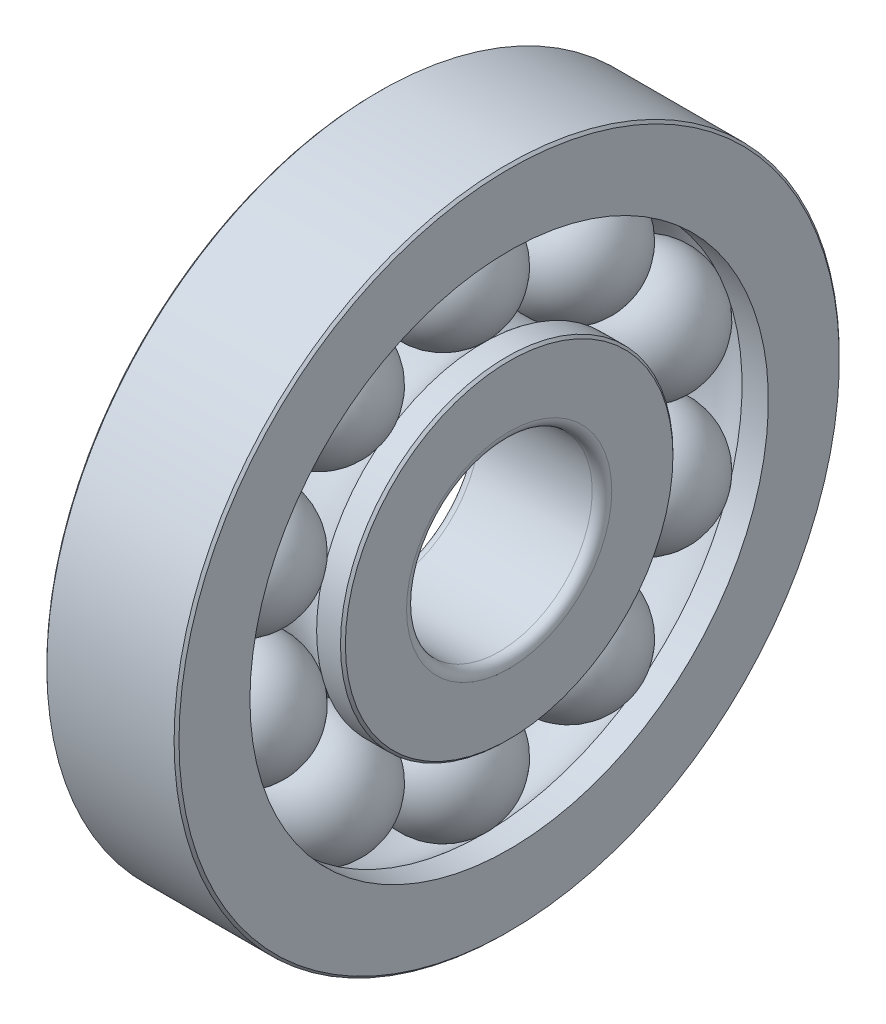
ISO-10303-21;
HEADER;
FILE_DESCRIPTION(('STEP AP214'),'2;1');
FILE_NAME('part.step','',(''),(''),'','','');
FILE_SCHEMA(('AUTOMOTIVE_DESIGN { 1 0 10303 214 1 1 1 1 }'));
ENDSEC;
DATA;
#1=APPLICATION_CONTEXT('core data for automotive mechanical design processes');
#2=APPLICATION_PROTOCOL_DEFINITION('international standard','automotive_design',2000,#1);
#3=PRODUCT_CONTEXT('',#1,'mechanical');
#4=PRODUCT('Part','Part','',(#3));
#5=PRODUCT_RELATED_PRODUCT_CATEGORY('part','',(#4));
#6=PRODUCT_DEFINITION_FORMATION('','',#4);
#7=PRODUCT_DEFINITION_CONTEXT('part definition',#1,'design');
#8=PRODUCT_DEFINITION('design','',#6,#7);
#9=PRODUCT_DEFINITION_SHAPE('','',#8);
#10=(LENGTH_UNIT() NAMED_UNIT(*) SI_UNIT(.MILLI.,.METRE.));
#11=(NAMED_UNIT(*) PLANE_ANGLE_UNIT() SI_UNIT($,.RADIAN.));
#12=(NAMED_UNIT(*) SI_UNIT($,.STERADIAN.) SOLID_ANGLE_UNIT());
#13=UNCERTAINTY_MEASURE_WITH_UNIT(LENGTH_MEASURE(1.E-05),#10,'distance_accuracy_value','');
#14=(GEOMETRIC_REPRESENTATION_CONTEXT(3) GLOBAL_UNCERTAINTY_ASSIGNED_CONTEXT((#13)) GLOBAL_UNIT_ASSIGNED_CONTEXT((#10,
#11,#12)) REPRESENTATION_CONTEXT('',''));
#15=CARTESIAN_POINT('',(0.,0.,0.));
#16=DIRECTION('',(0.,0.,1.));
#17=DIRECTION('',(1.,0.,0.));
#18=AXIS2_PLACEMENT_3D('',#15,#16,#17);
#19=CARTESIAN_POINT('',(0.,-8.3018686220501,25.550524385876));
#20=DIRECTION('',(-1.,0.,0.));
#21=DIRECTION('',(0.,0.809016994374955,0.587785252292462));
#22=AXIS2_PLACEMENT_3D('',#19,#20,#21);
#23=SPHERICAL_SURFACE('',#22,12.5);
#24=CARTESIAN_POINT('',(-12.5,-8.3018686220501,25.550524385876));
#25=VERTEX_POINT('',#24);
#26=VERTEX_LOOP('',#25);
#27=FACE_BOUND('',#26,.T.);
#28=ADVANCED_FACE('F48',(#27),#23,.T.);
#29=CLOSED_SHELL('',(#28));
#30=MANIFOLD_SOLID_BREP('B2',#29);
#31=CARTESIAN_POINT('',(0.,-30.0364428447143,41.341616886731));
#32=DIRECTION('',(-1.,0.,0.));
#33=DIRECTION('',(0.,0.309016994374958,0.95105651629515));
#34=AXIS2_PLACEMENT_3D('',#31,#32,#33);
#35=SPHERICAL_SURFACE('',#34,12.5);
#36=CARTESIAN_POINT('',(-12.5,-30.0364428447143,41.341616886731));
#37=VERTEX_POINT('',#36);
#38=VERTEX_LOOP('',#37);
#39=FACE_BOUND('',#38,.T.);
#40=ADVANCED_FACE('F70',(#39),#35,.T.);
#41=CLOSED_SHELL('',(#40));
#42=MANIFOLD_SOLID_BREP('B7',#41);
#43=CARTESIAN_POINT('',(0.,-56.9018540459421,41.3416168867312));
#44=DIRECTION('',(-1.,0.,0.));
#45=DIRECTION('',(0.,-0.309016994374938,0.951056516295157));
#46=AXIS2_PLACEMENT_3D('',#43,#44,#45);
#47=SPHERICAL_SURFACE('',#46,12.5);
#48=CARTESIAN_POINT('',(-12.5,-56.9018540459421,41.3416168867312));
#49=VERTEX_POINT('',#48);
#50=VERTEX_LOOP('',#49);
#51=FACE_BOUND('',#50,.T.);
#52=ADVANCED_FACE('F92',(#51),#47,.T.);
#53=CLOSED_SHELL('',(#52));
#54=MANIFOLD_SOLID_BREP('B44',#53);
#55=CARTESIAN_POINT('',(0.,-78.6364282686066,25.5505243858767));
#56=DIRECTION('',(-1.,0.,0.));
#57=DIRECTION('',(0.,-0.809016994374942,0.58778525229248));
#58=AXIS2_PLACEMENT_3D('',#55,#56,#57);
#59=SPHERICAL_SURFACE('',#58,12.5);
#60=CARTESIAN_POINT('',(-12.5,-78.6364282686066,25.5505243858767));
#61=VERTEX_POINT('',#60);
#62=VERTEX_LOOP('',#61);
#63=FACE_BOUND('',#62,.T.);
#64=ADVANCED_FACE('F114',(#63),#59,.T.);
#65=CLOSED_SHELL('',(#64));
#66=MANIFOLD_SOLID_BREP('B66',#65);
#67=CARTESIAN_POINT('',(0.,-86.9382968906572,0.));
#68=DIRECTION('',(-1.,0.,0.));
#69=DIRECTION('',(0.,-1.,0.));
#70=AXIS2_PLACEMENT_3D('',#67,#68,#69);
#71=SPHERICAL_SURFACE('',#70,12.5);
#72=CARTESIAN_POINT('',(-12.5,-86.9382968906572,0.));
#73=VERTEX_POINT('',#72);
#74=VERTEX_LOOP('',#73);
#75=FACE_BOUND('',#74,.T.);
#76=ADVANCED_FACE('F136',(#75),#71,.T.);
#77=CLOSED_SHELL('',(#76));
#78=MANIFOLD_SOLID_BREP('B88',#77);
#79=CARTESIAN_POINT('',(0.,-78.6364282686069,-25.5505243858762));
#80=DIRECTION('',(-1.,0.,0.));
#81=DIRECTION('',(0.,-0.809016994374951,-0.587785252292469));
#82=AXIS2_PLACEMENT_3D('',#79,#80,#81);
#83=SPHERICAL_SURFACE('',#82,12.5);
#84=CARTESIAN_POINT('',(-12.5,-78.6364282686069,-25.5505243858762));
#85=VERTEX_POINT('',#84);
#86=VERTEX_LOOP('',#85);
#87=FACE_BOUND('',#86,.T.);
#88=ADVANCED_FACE('F158',(#87),#83,.T.);
#89=CLOSED_SHELL('',(#88));
#90=MANIFOLD_SOLID_BREP('B110',#89);
#91=CARTESIAN_POINT('',(0.,-56.9018540459427,-41.3416168867311));
#92=DIRECTION('',(-1.,0.,0.));
#93=DIRECTION('',(0.,-0.309016994374952,-0.951056516295152));
#94=AXIS2_PLACEMENT_3D('',#91,#92,#93);
#95=SPHERICAL_SURFACE('',#94,12.5);
#96=CARTESIAN_POINT('',(-12.5,-56.9018540459427,-41.3416168867311));
#97=VERTEX_POINT('',#96);
#98=VERTEX_LOOP('',#97);
#99=FACE_BOUND('',#98,.T.);
#100=ADVANCED_FACE('F179',(#99),#95,.T.);
#101=CLOSED_SHELL('',(#100));
#102=MANIFOLD_SOLID_BREP('B132',#101);
#103=CARTESIAN_POINT('',(0.,-30.0364428447149,-41.3416168867312));
#104=DIRECTION('',(-1.,0.,0.));
#105=DIRECTION('',(0.,0.309016994374945,-0.951056516295155));
#106=AXIS2_PLACEMENT_3D('',#103,#104,#105);
#107=SPHERICAL_SURFACE('',#106,12.5);
#108=CARTESIAN_POINT('',(-12.5,-30.0364428447149,-41.3416168867312));
#109=VERTEX_POINT('',#108);
#110=VERTEX_LOOP('',#109);
#111=FACE_BOUND('',#110,.T.);
#112=ADVANCED_FACE('F197',(#111),#107,.T.);
#113=CLOSED_SHELL('',(#112));
#114=MANIFOLD_SOLID_BREP('B154',#113);
#115=CARTESIAN_POINT('',(0.,-8.30186862205046,-25.5505243858765));
#116=DIRECTION('',(-1.,0.,0.));
#117=DIRECTION('',(0.,0.809016994374947,-0.587785252292474));
#118=AXIS2_PLACEMENT_3D('',#115,#116,#117);
#119=SPHERICAL_SURFACE('',#118,12.5);
#120=CARTESIAN_POINT('',(-12.5,-8.30186862205046,-25.5505243858765));
#121=VERTEX_POINT('',#120);
#122=VERTEX_LOOP('',#121);
#123=FACE_BOUND('',#122,.T.);
#124=ADVANCED_FACE('F218',(#123),#119,.T.);
#125=CLOSED_SHELL('',(#124));
#126=MANIFOLD_SOLID_BREP('B175',#125);
#127=CARTESIAN_POINT('',(13.5,-9.5,0.));
#128=DIRECTION('',(-1.,0.,0.));
#129=DIRECTION('',(0.,0.,1.));
#130=AXIS2_PLACEMENT_3D('',#127,#128,#129);
#131=PLANE('',#130);
#132=CARTESIAN_POINT('',(13.5,-43.4691484453286,0.));
#133=DIRECTION('',(-1.,0.,0.));
#134=DIRECTION('',(0.,0.,1.));
#135=AXIS2_PLACEMENT_3D('',#132,#133,#134);
#136=CIRCLE('',#135,20.9691484453286);
#137=CARTESIAN_POINT('',(13.5,-43.4691484453286,20.9691484453286));
#138=VERTEX_POINT('',#137);
#139=EDGE_CURVE('E252',#138,#138,#136,.T.);
#140=ORIENTED_EDGE('',*,*,#139,.T.);
#141=EDGE_LOOP('',(#140));
#142=FACE_BOUND('',#141,.T.);
#143=CARTESIAN_POINT('',(13.5,-43.4691484453286,0.));
#144=DIRECTION('',(-1.,0.,0.));
#145=DIRECTION('',(0.,0.,1.));
#146=AXIS2_PLACEMENT_3D('',#143,#144,#145);
#147=CIRCLE('',#146,33.4691484453286);
#148=CARTESIAN_POINT('',(13.5,-43.4691484453286,33.4691484453286));
#149=VERTEX_POINT('',#148);
#150=EDGE_CURVE('E267',#149,#149,#147,.F.);
#151=ORIENTED_EDGE('',*,*,#150,.T.);
#152=EDGE_LOOP('',(#151));
#153=FACE_BOUND('',#152,.T.);
#154=ADVANCED_FACE('F241',(#142,#153),#131,.F.);
#155=CARTESIAN_POINT('',(-34.4921936546022,-43.4691484453286,0.));
#156=DIRECTION('',(-1.,0.,0.));
#157=DIRECTION('',(0.,0.,1.));
#158=AXIS2_PLACEMENT_3D('',#155,#156,#157);
#159=CYLINDRICAL_SURFACE('',#158,33.9691484453286);
#160=CARTESIAN_POINT('',(13.,-43.4691484453286,0.));
#161=DIRECTION('',(-1.,0.,0.));
#162=DIRECTION('',(0.,0.,1.));
#163=AXIS2_PLACEMENT_3D('',#160,#161,#162);
#164=CIRCLE('',#163,33.9691484453286);
#165=CARTESIAN_POINT('',(13.,-43.4691484453286,33.9691484453286));
#166=VERTEX_POINT('',#165);
#167=EDGE_CURVE('E270',#166,#166,#164,.T.);
#168=ORIENTED_EDGE('',*,*,#167,.T.);
#169=EDGE_LOOP('',(#168));
#170=FACE_BOUND('',#169,.T.);
#171=CARTESIAN_POINT('',(8.12403840463596,-43.4691484453286,0.));
#172=DIRECTION('',(-1.,0.,0.));
#173=DIRECTION('',(0.,0.,1.));
#174=AXIS2_PLACEMENT_3D('',#171,#172,#173);
#175=CIRCLE('',#174,33.9691484453286);
#176=CARTESIAN_POINT('',(8.12403840463596,-43.4691484453286,33.9691484453286));
#177=VERTEX_POINT('',#176);
#178=EDGE_CURVE('E273',#177,#177,#175,.T.);
#179=ORIENTED_EDGE('',*,*,#178,.F.);
#180=EDGE_LOOP('',(#179));
#181=FACE_BOUND('',#180,.T.);
#182=ADVANCED_FACE('F285',(#170,#181),#159,.T.);
#183=CARTESIAN_POINT('',(0.,-43.4691484453286,0.));
#184=DIRECTION('',(-1.,0.,0.));
#185=DIRECTION('',(0.,0.,1.));
#186=AXIS2_PLACEMENT_3D('',#183,#184,#185);
#187=TOROIDAL_SURFACE('',#186,43.4691484453286,12.5);
#188=CARTESIAN_POINT('',(-8.12403840463596,-43.4691484453286,0.));
#189=DIRECTION('',(-1.,0.,0.));
#190=DIRECTION('',(0.,0.,1.));
#191=AXIS2_PLACEMENT_3D('',#188,#189,#190);
#192=CIRCLE('',#191,33.9691484453286);
#193=CARTESIAN_POINT('',(-8.12403840463596,-43.4691484453286,33.9691484453286));
#194=VERTEX_POINT('',#193);
#195=EDGE_CURVE('E276',#194,#194,#192,.T.);
#196=ORIENTED_EDGE('',*,*,#195,.F.);
#197=EDGE_LOOP('',(#196));
#198=FACE_BOUND('',#197,.T.);
#199=ORIENTED_EDGE('',*,*,#178,.T.);
#200=EDGE_LOOP('',(#199));
#201=FACE_BOUND('',#200,.T.);
#202=ADVANCED_FACE('F282',(#198,#201),#187,.F.);
#203=CARTESIAN_POINT('',(-34.4921936546022,-43.4691484453286,0.));
#204=DIRECTION('',(-1.,0.,0.));
#205=DIRECTION('',(0.,0.,1.));
#206=AXIS2_PLACEMENT_3D('',#203,#204,#205);
#207=CYLINDRICAL_SURFACE('',#206,33.9691484453286);
#208=CARTESIAN_POINT('',(-13.,-43.4691484453286,0.));
#209=DIRECTION('',(1.,0.,0.));
#210=DIRECTION('',(0.,0.,-1.));
#211=AXIS2_PLACEMENT_3D('',#208,#209,#210);
#212=CIRCLE('',#211,33.9691484453286);
#213=CARTESIAN_POINT('',(-13.,-43.4691484453286,-33.9691484453286));
#214=VERTEX_POINT('',#213);
#215=EDGE_CURVE('E217',#214,#214,#212,.T.);
#216=ORIENTED_EDGE('',*,*,#215,.T.);
#217=EDGE_LOOP('',(#216));
#218=FACE_BOUND('',#217,.T.);
#219=ORIENTED_EDGE('',*,*,#195,.T.);
#220=EDGE_LOOP('',(#219));
#221=FACE_BOUND('',#220,.T.);
#222=ADVANCED_FACE('F280',(#218,#221),#207,.T.);
#223=CARTESIAN_POINT('',(-13.5,-9.5,0.));
#224=DIRECTION('',(1.,0.,0.));
#225=DIRECTION('',(0.,0.,-1.));
#226=AXIS2_PLACEMENT_3D('',#223,#224,#225);
#227=PLANE('',#226);
#228=CARTESIAN_POINT('',(-13.5,-43.4691484453286,0.));
#229=DIRECTION('',(1.,0.,0.));
#230=DIRECTION('',(0.,0.,-1.));
#231=AXIS2_PLACEMENT_3D('',#228,#229,#230);
#232=CIRCLE('',#231,33.4691484453286);
#233=CARTESIAN_POINT('',(-13.5,-43.4691484453286,-33.4691484453286));
#234=VERTEX_POINT('',#233);
#235=EDGE_CURVE('E248',#234,#234,#232,.F.);
#236=ORIENTED_EDGE('',*,*,#235,.T.);
#237=EDGE_LOOP('',(#236));
#238=FACE_BOUND('',#237,.T.);
#239=CARTESIAN_POINT('',(-13.5,-43.4691484453286,0.));
#240=DIRECTION('',(1.,0.,0.));
#241=DIRECTION('',(0.,0.,-1.));
#242=AXIS2_PLACEMENT_3D('',#239,#240,#241);
#243=CIRCLE('',#242,20.9691484453286);
#244=CARTESIAN_POINT('',(-13.5,-43.4691484453286,-20.9691484453286));
#245=VERTEX_POINT('',#244);
#246=EDGE_CURVE('E256',#245,#245,#243,.T.);
#247=ORIENTED_EDGE('',*,*,#246,.T.);
#248=EDGE_LOOP('',(#247));
#249=FACE_BOUND('',#248,.T.);
#250=ADVANCED_FACE('F325',(#238,#249),#227,.F.);
#251=CARTESIAN_POINT('',(-34.4921936546022,-43.4691484453286,0.));
#252=DIRECTION('',(-1.,0.,0.));
#253=DIRECTION('',(0.,0.,1.));
#254=AXIS2_PLACEMENT_3D('',#251,#252,#253);
#255=CYLINDRICAL_SURFACE('',#254,18.9691484453286);
#256=CARTESIAN_POINT('',(-11.5,-43.4691484453286,0.));
#257=DIRECTION('',(1.,0.,0.));
#258=DIRECTION('',(0.,0.,-1.));
#259=AXIS2_PLACEMENT_3D('',#256,#257,#258);
#260=CIRCLE('',#259,18.9691484453286);
#261=CARTESIAN_POINT('',(-11.5,-43.4691484453286,-18.9691484453286));
#262=VERTEX_POINT('',#261);
#263=EDGE_CURVE('E261',#262,#262,#260,.F.);
#264=ORIENTED_EDGE('',*,*,#263,.T.);
#265=EDGE_LOOP('',(#264));
#266=FACE_BOUND('',#265,.T.);
#267=CARTESIAN_POINT('',(11.5,-43.4691484453286,0.));
#268=DIRECTION('',(-1.,0.,0.));
#269=DIRECTION('',(0.,0.,1.));
#270=AXIS2_PLACEMENT_3D('',#267,#268,#269);
#271=CIRCLE('',#270,18.9691484453286);
#272=CARTESIAN_POINT('',(11.5,-43.4691484453286,18.9691484453286));
#273=VERTEX_POINT('',#272);
#274=EDGE_CURVE('E264',#273,#273,#271,.F.);
#275=ORIENTED_EDGE('',*,*,#274,.T.);
#276=EDGE_LOOP('',(#275));
#277=FACE_BOUND('',#276,.T.);
#278=ADVANCED_FACE('F305',(#266,#277),#255,.F.);
#279=CARTESIAN_POINT('',(13.,-43.4691484453286,0.));
#280=DIRECTION('',(-1.,0.,0.));
#281=DIRECTION('',(0.,0.,1.));
#282=AXIS2_PLACEMENT_3D('',#279,#280,#281);
#283=CONICAL_SURFACE('',#282,33.9691484453286,0.785398163397441);
#284=ORIENTED_EDGE('',*,*,#150,.F.);
#285=EDGE_LOOP('',(#284));
#286=FACE_BOUND('',#285,.T.);
#287=ORIENTED_EDGE('',*,*,#167,.F.);
#288=EDGE_LOOP('',(#287));
#289=FACE_BOUND('',#288,.T.);
#290=ADVANCED_FACE('F301',(#286,#289),#283,.T.);
#291=CARTESIAN_POINT('',(-11.5,-43.4691484453286,0.));
#292=DIRECTION('',(1.,0.,0.));
#293=DIRECTION('',(0.,0.,-1.));
#294=AXIS2_PLACEMENT_3D('',#291,#292,#293);
#295=TOROIDAL_SURFACE('',#294,20.9691484453286,2.);
#296=ORIENTED_EDGE('',*,*,#246,.F.);
#297=EDGE_LOOP('',(#296));
#298=FACE_BOUND('',#297,.T.);
#299=ORIENTED_EDGE('',*,*,#263,.F.);
#300=EDGE_LOOP('',(#299));
#301=FACE_BOUND('',#300,.T.);
#302=ADVANCED_FACE('F304',(#298,#301),#295,.T.);
#303=CARTESIAN_POINT('',(11.5,-43.4691484453286,0.));
#304=DIRECTION('',(-1.,0.,0.));
#305=DIRECTION('',(0.,0.,1.));
#306=AXIS2_PLACEMENT_3D('',#303,#304,#305);
#307=TOROIDAL_SURFACE('',#306,20.9691484453286,2.);
#308=ORIENTED_EDGE('',*,*,#274,.F.);
#309=EDGE_LOOP('',(#308));
#310=FACE_BOUND('',#309,.T.);
#311=ORIENTED_EDGE('',*,*,#139,.F.);
#312=EDGE_LOOP('',(#311));
#313=FACE_BOUND('',#312,.T.);
#314=ADVANCED_FACE('F308',(#310,#313),#307,.T.);
#315=CARTESIAN_POINT('',(-13.5,-43.4691484453286,0.));
#316=DIRECTION('',(1.,0.,0.));
#317=DIRECTION('',(0.,0.,-1.));
#318=AXIS2_PLACEMENT_3D('',#315,#316,#317);
#319=CONICAL_SURFACE('',#318,33.4691484453286,0.785398163397455);
#320=ORIENTED_EDGE('',*,*,#215,.F.);
#321=EDGE_LOOP('',(#320));
#322=FACE_BOUND('',#321,.T.);
#323=ORIENTED_EDGE('',*,*,#235,.F.);
#324=EDGE_LOOP('',(#323));
#325=FACE_BOUND('',#324,.T.);
#326=ADVANCED_FACE('F243',(#322,#325),#319,.T.);
#327=CLOSED_SHELL('',(#154,#182,#202,#222,#250,#278,#290,#302,#314,#326));
#328=MANIFOLD_SOLID_BREP('B193',#327);
#329=CARTESIAN_POINT('',(-34.4921936546022,-43.4691484453286,0.));
#330=DIRECTION('',(-1.,0.,0.));
#331=DIRECTION('',(0.,0.,1.));
#332=AXIS2_PLACEMENT_3D('',#329,#330,#331);
#333=CYLINDRICAL_SURFACE('',#332,52.9691484453286);
#334=CARTESIAN_POINT('',(13.5,-43.4691484453286,0.));
#335=DIRECTION('',(-1.,0.,0.));
#336=DIRECTION('',(0.,0.,1.));
#337=AXIS2_PLACEMENT_3D('',#334,#335,#336);
#338=CIRCLE('',#337,52.9691484453286);
#339=CARTESIAN_POINT('',(13.5,-43.4691484453286,52.9691484453286));
#340=VERTEX_POINT('',#339);
#341=EDGE_CURVE('E418',#340,#340,#338,.T.);
#342=ORIENTED_EDGE('',*,*,#341,.F.);
#343=EDGE_LOOP('',(#342));
#344=FACE_BOUND('',#343,.T.);
#345=CARTESIAN_POINT('',(8.12403840463596,-43.4691484453286,0.));
#346=DIRECTION('',(-1.,0.,0.));
#347=DIRECTION('',(0.,0.,1.));
#348=AXIS2_PLACEMENT_3D('',#345,#346,#347);
#349=CIRCLE('',#348,52.9691484453286);
#350=CARTESIAN_POINT('',(8.12403840463596,-43.4691484453286,52.9691484453286));
#351=VERTEX_POINT('',#350);
#352=EDGE_CURVE('E427',#351,#351,#349,.T.);
#353=ORIENTED_EDGE('',*,*,#352,.T.);
#354=EDGE_LOOP('',(#353));
#355=FACE_BOUND('',#354,.T.);
#356=ADVANCED_FACE('F398',(#344,#355),#333,.F.);
#357=CARTESIAN_POINT('',(13.5,24.5,0.));
#358=DIRECTION('',(-1.,0.,0.));
#359=DIRECTION('',(0.,0.,1.));
#360=AXIS2_PLACEMENT_3D('',#357,#358,#359);
#361=PLANE('',#360);
#362=CARTESIAN_POINT('',(13.5,-43.4691484453286,0.));
#363=DIRECTION('',(-1.,0.,0.));
#364=DIRECTION('',(0.,0.,1.));
#365=AXIS2_PLACEMENT_3D('',#362,#363,#364);
#366=CIRCLE('',#365,67.4691484453286);
#367=CARTESIAN_POINT('',(13.5,-43.4691484453286,67.4691484453286));
#368=VERTEX_POINT('',#367);
#369=EDGE_CURVE('E409',#368,#368,#366,.F.);
#370=ORIENTED_EDGE('',*,*,#369,.T.);
#371=EDGE_LOOP('',(#370));
#372=FACE_BOUND('',#371,.T.);
#373=ORIENTED_EDGE('',*,*,#341,.T.);
#374=EDGE_LOOP('',(#373));
#375=FACE_BOUND('',#374,.T.);
#376=ADVANCED_FACE('F453',(#372,#375),#361,.F.);
#377=CARTESIAN_POINT('',(-34.4921936546022,-43.4691484453286,0.));
#378=DIRECTION('',(-1.,0.,0.));
#379=DIRECTION('',(0.,0.,1.));
#380=AXIS2_PLACEMENT_3D('',#377,#378,#379);
#381=CYLINDRICAL_SURFACE('',#380,67.9691484453286);
#382=CARTESIAN_POINT('',(-13.,-43.4691484453286,0.));
#383=DIRECTION('',(1.,0.,0.));
#384=DIRECTION('',(0.,0.,-1.));
#385=AXIS2_PLACEMENT_3D('',#382,#383,#384);
#386=CIRCLE('',#385,67.9691484453286);
#387=CARTESIAN_POINT('',(-13.,-43.4691484453286,-67.9691484453286));
#388=VERTEX_POINT('',#387);
#389=EDGE_CURVE('E240',#388,#388,#386,.T.);
#390=ORIENTED_EDGE('',*,*,#389,.T.);
#391=EDGE_LOOP('',(#390));
#392=FACE_BOUND('',#391,.T.);
#393=CARTESIAN_POINT('',(13.,-43.4691484453286,0.));
#394=DIRECTION('',(-1.,0.,0.));
#395=DIRECTION('',(0.,0.,1.));
#396=AXIS2_PLACEMENT_3D('',#393,#394,#395);
#397=CIRCLE('',#396,67.9691484453286);
#398=CARTESIAN_POINT('',(13.,-43.4691484453286,67.9691484453286));
#399=VERTEX_POINT('',#398);
#400=EDGE_CURVE('E413',#399,#399,#397,.T.);
#401=ORIENTED_EDGE('',*,*,#400,.T.);
#402=EDGE_LOOP('',(#401));
#403=FACE_BOUND('',#402,.T.);
#404=ADVANCED_FACE('F447',(#392,#403),#381,.T.);
#405=CARTESIAN_POINT('',(-13.5,24.5,0.));
#406=DIRECTION('',(1.,0.,0.));
#407=DIRECTION('',(0.,0.,-1.));
#408=AXIS2_PLACEMENT_3D('',#405,#406,#407);
#409=PLANE('',#408);
#410=CARTESIAN_POINT('',(-13.5,-43.4691484453286,0.));
#411=DIRECTION('',(1.,0.,0.));
#412=DIRECTION('',(0.,0.,-1.));
#413=AXIS2_PLACEMENT_3D('',#410,#411,#412);
#414=CIRCLE('',#413,67.4691484453286);
#415=CARTESIAN_POINT('',(-13.5,-43.4691484453286,-67.4691484453286));
#416=VERTEX_POINT('',#415);
#417=EDGE_CURVE('E405',#416,#416,#414,.F.);
#418=ORIENTED_EDGE('',*,*,#417,.T.);
#419=EDGE_LOOP('',(#418));
#420=FACE_BOUND('',#419,.T.);
#421=CARTESIAN_POINT('',(-13.5,-43.4691484453286,0.));
#422=DIRECTION('',(-1.,0.,0.));
#423=DIRECTION('',(0.,0.,1.));
#424=AXIS2_PLACEMENT_3D('',#421,#422,#423);
#425=CIRCLE('',#424,52.9691484453286);
#426=CARTESIAN_POINT('',(-13.5,-43.4691484453286,52.9691484453286));
#427=VERTEX_POINT('',#426);
#428=EDGE_CURVE('E421',#427,#427,#425,.T.);
#429=ORIENTED_EDGE('',*,*,#428,.F.);
#430=EDGE_LOOP('',(#429));
#431=FACE_BOUND('',#430,.T.);
#432=ADVANCED_FACE('F442',(#420,#431),#409,.F.);
#433=CARTESIAN_POINT('',(-34.4921936546022,-43.4691484453286,0.));
#434=DIRECTION('',(-1.,0.,0.));
#435=DIRECTION('',(0.,0.,1.));
#436=AXIS2_PLACEMENT_3D('',#433,#434,#435);
#437=CYLINDRICAL_SURFACE('',#436,52.9691484453286);
#438=CARTESIAN_POINT('',(-8.12403840463596,-43.4691484453286,0.));
#439=DIRECTION('',(-1.,0.,0.));
#440=DIRECTION('',(0.,0.,1.));
#441=AXIS2_PLACEMENT_3D('',#438,#439,#440);
#442=CIRCLE('',#441,52.9691484453286);
#443=CARTESIAN_POINT('',(-8.12403840463596,-43.4691484453286,52.9691484453286));
#444=VERTEX_POINT('',#443);
#445=EDGE_CURVE('E424',#444,#444,#442,.T.);
#446=ORIENTED_EDGE('',*,*,#445,.F.);
#447=EDGE_LOOP('',(#446));
#448=FACE_BOUND('',#447,.T.);
#449=ORIENTED_EDGE('',*,*,#428,.T.);
#450=EDGE_LOOP('',(#449));
#451=FACE_BOUND('',#450,.T.);
#452=ADVANCED_FACE('F436',(#448,#451),#437,.F.);
#453=CARTESIAN_POINT('',(0.,-43.4691484453286,0.));
#454=DIRECTION('',(-1.,0.,0.));
#455=DIRECTION('',(0.,0.,1.));
#456=AXIS2_PLACEMENT_3D('',#453,#454,#455);
#457=TOROIDAL_SURFACE('',#456,43.4691484453286,12.5);
#458=ORIENTED_EDGE('',*,*,#352,.F.);
#459=EDGE_LOOP('',(#458));
#460=FACE_BOUND('',#459,.T.);
#461=ORIENTED_EDGE('',*,*,#445,.T.);
#462=EDGE_LOOP('',(#461));
#463=FACE_BOUND('',#462,.T.);
#464=ADVANCED_FACE('F432',(#460,#463),#457,.F.);
#465=CARTESIAN_POINT('',(13.,-43.4691484453286,0.));
#466=DIRECTION('',(-1.,0.,0.));
#467=DIRECTION('',(0.,0.,1.));
#468=AXIS2_PLACEMENT_3D('',#465,#466,#467);
#469=CONICAL_SURFACE('',#468,67.9691484453286,0.785398163397448);
#470=ORIENTED_EDGE('',*,*,#369,.F.);
#471=EDGE_LOOP('',(#470));
#472=FACE_BOUND('',#471,.T.);
#473=ORIENTED_EDGE('',*,*,#400,.F.);
#474=EDGE_LOOP('',(#473));
#475=FACE_BOUND('',#474,.T.);
#476=ADVANCED_FACE('F435',(#472,#475),#469,.T.);
#477=CARTESIAN_POINT('',(-13.5,-43.4691484453286,0.));
#478=DIRECTION('',(1.,0.,0.));
#479=DIRECTION('',(0.,0.,-1.));
#480=AXIS2_PLACEMENT_3D('',#477,#478,#479);
#481=CONICAL_SURFACE('',#480,67.4691484453286,0.785398163397435);
#482=ORIENTED_EDGE('',*,*,#389,.F.);
#483=EDGE_LOOP('',(#482));
#484=FACE_BOUND('',#483,.T.);
#485=ORIENTED_EDGE('',*,*,#417,.F.);
#486=EDGE_LOOP('',(#485));
#487=FACE_BOUND('',#486,.T.);
#488=ADVANCED_FACE('F400',(#484,#487),#481,.T.);
#489=CLOSED_SHELL('',(#356,#376,#404,#432,#452,#464,#476,#488));
#490=MANIFOLD_SOLID_BREP('B212',#489);
#491=CARTESIAN_POINT('',(0.,0.,0.));
#492=DIRECTION('',(-1.,0.,0.));
#493=DIRECTION('',(0.,1.,0.));
#494=AXIS2_PLACEMENT_3D('',#491,#492,#493);
#495=SPHERICAL_SURFACE('',#494,12.5);
#496=CARTESIAN_POINT('',(-12.5,0.,0.));
#497=VERTEX_POINT('',#496);
#498=VERTEX_LOOP('',#497);
#499=FACE_BOUND('',#498,.T.);
#500=ADVANCED_FACE('F522',(#499),#495,.T.);
#501=CLOSED_SHELL('',(#500));
#502=MANIFOLD_SOLID_BREP('B235',#501);
#503=ADVANCED_BREP_SHAPE_REPRESENTATION('',(#18,#30,#42,#54,#66,#78,#90,#102,#114,#126,#328,
#490,#502),#14);
#504=SHAPE_DEFINITION_REPRESENTATION(#9,#503);
ENDSEC;
END-ISO-10303-21;
